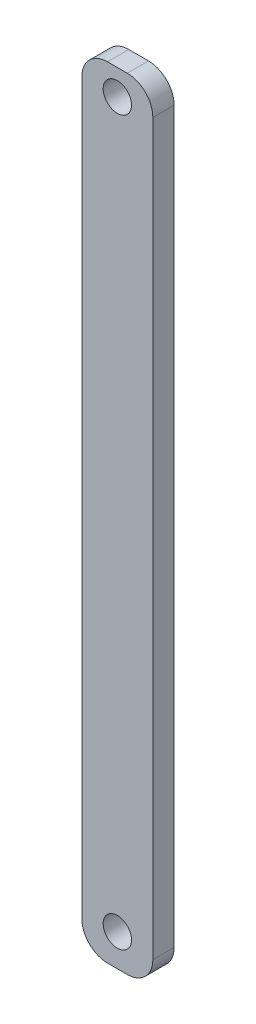
ISO-10303-21;
HEADER;
FILE_DESCRIPTION(('STEP AP214'),'2;1');
FILE_NAME('part.step','',(''),(''),'','','');
FILE_SCHEMA(('AUTOMOTIVE_DESIGN { 1 0 10303 214 1 1 1 1 }'));
ENDSEC;
DATA;
#1=APPLICATION_CONTEXT('core data for automotive mechanical design processes');
#2=APPLICATION_PROTOCOL_DEFINITION('international standard','automotive_design',2000,#1);
#3=PRODUCT_CONTEXT('',#1,'mechanical');
#4=PRODUCT('Part','Part','',(#3));
#5=PRODUCT_RELATED_PRODUCT_CATEGORY('part','',(#4));
#6=PRODUCT_DEFINITION_FORMATION('','',#4);
#7=PRODUCT_DEFINITION_CONTEXT('part definition',#1,'design');
#8=PRODUCT_DEFINITION('design','',#6,#7);
#9=PRODUCT_DEFINITION_SHAPE('','',#8);
#10=(LENGTH_UNIT() NAMED_UNIT(*) SI_UNIT(.MILLI.,.METRE.));
#11=(NAMED_UNIT(*) PLANE_ANGLE_UNIT() SI_UNIT($,.RADIAN.));
#12=(NAMED_UNIT(*) SI_UNIT($,.STERADIAN.) SOLID_ANGLE_UNIT());
#13=UNCERTAINTY_MEASURE_WITH_UNIT(LENGTH_MEASURE(1.E-05),#10,'distance_accuracy_value','');
#14=(GEOMETRIC_REPRESENTATION_CONTEXT(3) GLOBAL_UNCERTAINTY_ASSIGNED_CONTEXT((#13)) GLOBAL_UNIT_ASSIGNED_CONTEXT((#10,
#11,#12)) REPRESENTATION_CONTEXT('',''));
#15=CARTESIAN_POINT('',(0.,0.,0.));
#16=DIRECTION('',(0.,0.,1.));
#17=DIRECTION('',(1.,0.,0.));
#18=AXIS2_PLACEMENT_3D('',#15,#16,#17);
#19=CARTESIAN_POINT('',(-12.7000000000001,-321.4,7.5));
#20=DIRECTION('',(1.,0.,0.));
#21=DIRECTION('',(0.,0.,-1.));
#22=AXIS2_PLACEMENT_3D('',#19,#20,#21);
#23=PLANE('',#22);
#24=DIRECTION('',(0.,-1.,0.));
#25=VECTOR('',#24,1.);
#26=CARTESIAN_POINT('',(-12.7000000000001,-321.4,-7.5));
#27=LINE('',#26,#25);
#28=CARTESIAN_POINT('',(-12.7000000000001,210.6,-7.5));
#29=VERTEX_POINT('',#28);
#30=CARTESIAN_POINT('',(-12.7000000000001,-303.4,-7.5));
#31=VERTEX_POINT('',#30);
#32=EDGE_CURVE('E146',#29,#31,#27,.T.);
#33=ORIENTED_EDGE('',*,*,#32,.T.);
#34=DIRECTION('',(0.,0.,-1.));
#35=VECTOR('',#34,1.);
#36=CARTESIAN_POINT('',(-12.7000000000001,-303.4,7.5));
#37=LINE('',#36,#35);
#38=CARTESIAN_POINT('',(-12.7000000000001,-303.4,7.5));
#39=VERTEX_POINT('',#38);
#40=EDGE_CURVE('E180',#31,#39,#37,.F.);
#41=ORIENTED_EDGE('',*,*,#40,.T.);
#42=DIRECTION('',(0.,-1.,0.));
#43=VECTOR('',#42,1.);
#44=CARTESIAN_POINT('',(-12.7000000000001,-321.4,7.5));
#45=LINE('',#44,#43);
#46=CARTESIAN_POINT('',(-12.7000000000001,210.6,7.5));
#47=VERTEX_POINT('',#46);
#48=EDGE_CURVE('E144',#47,#39,#45,.T.);
#49=ORIENTED_EDGE('',*,*,#48,.F.);
#50=DIRECTION('',(0.,0.,-1.));
#51=VECTOR('',#50,1.);
#52=CARTESIAN_POINT('',(-12.7000000000001,210.6,7.5));
#53=LINE('',#52,#51);
#54=EDGE_CURVE('E176',#47,#29,#53,.T.);
#55=ORIENTED_EDGE('',*,*,#54,.T.);
#56=EDGE_LOOP('',(#33,#41,#49,#55));
#57=FACE_BOUND('',#56,.T.);
#58=ADVANCED_FACE('F45',(#57),#23,.F.);
#59=CARTESIAN_POINT('',(37.2999999999999,-321.4,7.5));
#60=DIRECTION('',(0.,1.,0.));
#61=DIRECTION('',(0.,0.,1.));
#62=AXIS2_PLACEMENT_3D('',#59,#60,#61);
#63=PLANE('',#62);
#64=DIRECTION('',(1.,0.,0.));
#65=VECTOR('',#64,1.);
#66=CARTESIAN_POINT('',(37.2999999999999,-321.4,-7.5));
#67=LINE('',#66,#65);
#68=CARTESIAN_POINT('',(5.29999999999993,-321.4,-7.5));
#69=VERTEX_POINT('',#68);
#70=CARTESIAN_POINT('',(19.2999999999999,-321.4,-7.5));
#71=VERTEX_POINT('',#70);
#72=EDGE_CURVE('E140',#69,#71,#67,.T.);
#73=ORIENTED_EDGE('',*,*,#72,.T.);
#74=DIRECTION('',(0.,0.,-1.));
#75=VECTOR('',#74,1.);
#76=CARTESIAN_POINT('',(19.2999999999999,-321.4,7.5));
#77=LINE('',#76,#75);
#78=CARTESIAN_POINT('',(19.2999999999999,-321.4,7.5));
#79=VERTEX_POINT('',#78);
#80=EDGE_CURVE('E116',#71,#79,#77,.F.);
#81=ORIENTED_EDGE('',*,*,#80,.T.);
#82=DIRECTION('',(1.,0.,0.));
#83=VECTOR('',#82,1.);
#84=CARTESIAN_POINT('',(37.2999999999999,-321.4,7.5));
#85=LINE('',#84,#83);
#86=CARTESIAN_POINT('',(5.29999999999993,-321.4,7.5));
#87=VERTEX_POINT('',#86);
#88=EDGE_CURVE('E199',#87,#79,#85,.T.);
#89=ORIENTED_EDGE('',*,*,#88,.F.);
#90=DIRECTION('',(0.,0.,-1.));
#91=VECTOR('',#90,1.);
#92=CARTESIAN_POINT('',(5.29999999999993,-321.4,7.5));
#93=LINE('',#92,#91);
#94=EDGE_CURVE('E122',#87,#69,#93,.T.);
#95=ORIENTED_EDGE('',*,*,#94,.T.);
#96=EDGE_LOOP('',(#73,#81,#89,#95));
#97=FACE_BOUND('',#96,.T.);
#98=ADVANCED_FACE('F245',(#97),#63,.F.);
#99=CARTESIAN_POINT('',(37.2999999999999,-321.4,7.5));
#100=DIRECTION('',(-1.,0.,0.));
#101=DIRECTION('',(0.,0.,1.));
#102=AXIS2_PLACEMENT_3D('',#99,#100,#101);
#103=PLANE('',#102);
#104=DIRECTION('',(0.,1.,0.));
#105=VECTOR('',#104,1.);
#106=CARTESIAN_POINT('',(37.2999999999999,-321.4,7.5));
#107=LINE('',#106,#105);
#108=CARTESIAN_POINT('',(37.2999999999999,-303.4,7.5));
#109=VERTEX_POINT('',#108);
#110=CARTESIAN_POINT('',(37.2999999999999,210.6,7.5));
#111=VERTEX_POINT('',#110);
#112=EDGE_CURVE('E131',#109,#111,#107,.T.);
#113=ORIENTED_EDGE('',*,*,#112,.F.);
#114=DIRECTION('',(0.,0.,-1.));
#115=VECTOR('',#114,1.);
#116=CARTESIAN_POINT('',(37.2999999999999,-303.4,7.5));
#117=LINE('',#116,#115);
#118=CARTESIAN_POINT('',(37.2999999999999,-303.4,-7.5));
#119=VERTEX_POINT('',#118);
#120=EDGE_CURVE('E115',#109,#119,#117,.T.);
#121=ORIENTED_EDGE('',*,*,#120,.T.);
#122=DIRECTION('',(0.,1.,0.));
#123=VECTOR('',#122,1.);
#124=CARTESIAN_POINT('',(37.2999999999999,-321.4,-7.5));
#125=LINE('',#124,#123);
#126=CARTESIAN_POINT('',(37.2999999999999,210.6,-7.5));
#127=VERTEX_POINT('',#126);
#128=EDGE_CURVE('E129',#119,#127,#125,.T.);
#129=ORIENTED_EDGE('',*,*,#128,.T.);
#130=DIRECTION('',(0.,0.,-1.));
#131=VECTOR('',#130,1.);
#132=CARTESIAN_POINT('',(37.2999999999999,210.6,7.5));
#133=LINE('',#132,#131);
#134=EDGE_CURVE('E134',#127,#111,#133,.F.);
#135=ORIENTED_EDGE('',*,*,#134,.T.);
#136=EDGE_LOOP('',(#113,#121,#129,#135));
#137=FACE_BOUND('',#136,.T.);
#138=ADVANCED_FACE('F128',(#137),#103,.F.);
#139=CARTESIAN_POINT('',(37.2999999999999,228.6,7.5));
#140=DIRECTION('',(0.,-1.,0.));
#141=DIRECTION('',(0.,0.,-1.));
#142=AXIS2_PLACEMENT_3D('',#139,#140,#141);
#143=PLANE('',#142);
#144=DIRECTION('',(-1.,0.,0.));
#145=VECTOR('',#144,1.);
#146=CARTESIAN_POINT('',(37.2999999999999,228.6,-7.5));
#147=LINE('',#146,#145);
#148=CARTESIAN_POINT('',(19.2999999999999,228.6,-7.5));
#149=VERTEX_POINT('',#148);
#150=CARTESIAN_POINT('',(5.29999999999993,228.6,-7.5));
#151=VERTEX_POINT('',#150);
#152=EDGE_CURVE('E139',#149,#151,#147,.T.);
#153=ORIENTED_EDGE('',*,*,#152,.T.);
#154=DIRECTION('',(0.,0.,-1.));
#155=VECTOR('',#154,1.);
#156=CARTESIAN_POINT('',(5.29999999999993,228.6,7.5));
#157=LINE('',#156,#155);
#158=CARTESIAN_POINT('',(5.29999999999993,228.6,7.5));
#159=VERTEX_POINT('',#158);
#160=EDGE_CURVE('E11',#151,#159,#157,.F.);
#161=ORIENTED_EDGE('',*,*,#160,.T.);
#162=DIRECTION('',(-1.,0.,0.));
#163=VECTOR('',#162,1.);
#164=CARTESIAN_POINT('',(37.2999999999999,228.6,7.5));
#165=LINE('',#164,#163);
#166=CARTESIAN_POINT('',(19.2999999999999,228.6,7.5));
#167=VERTEX_POINT('',#166);
#168=EDGE_CURVE('E151',#167,#159,#165,.T.);
#169=ORIENTED_EDGE('',*,*,#168,.F.);
#170=DIRECTION('',(0.,0.,-1.));
#171=VECTOR('',#170,1.);
#172=CARTESIAN_POINT('',(19.2999999999999,228.6,7.5));
#173=LINE('',#172,#171);
#174=EDGE_CURVE('E54',#167,#149,#173,.T.);
#175=ORIENTED_EDGE('',*,*,#174,.T.);
#176=EDGE_LOOP('',(#153,#161,#169,#175));
#177=FACE_BOUND('',#176,.T.);
#178=ADVANCED_FACE('F185',(#177),#143,.F.);
#179=CARTESIAN_POINT('',(0.,0.,7.5));
#180=DIRECTION('',(0.,0.,1.));
#181=DIRECTION('',(1.,0.,0.));
#182=AXIS2_PLACEMENT_3D('',#179,#180,#181);
#183=PLANE('',#182);
#184=CARTESIAN_POINT('',(12.2999999999999,-298.842314327089,7.5));
#185=DIRECTION('',(0.,0.,1.));
#186=DIRECTION('',(1.,0.,0.));
#187=AXIS2_PLACEMENT_3D('',#184,#185,#186);
#188=CIRCLE('',#187,10.);
#189=CARTESIAN_POINT('',(22.2999999999999,-298.842314327089,7.5));
#190=VERTEX_POINT('',#189);
#191=EDGE_CURVE('E221',#190,#190,#188,.T.);
#192=ORIENTED_EDGE('',*,*,#191,.F.);
#193=EDGE_LOOP('',(#192));
#194=FACE_BOUND('',#193,.T.);
#195=CARTESIAN_POINT('',(12.2999999999999,210.6,7.5));
#196=DIRECTION('',(0.,0.,1.));
#197=DIRECTION('',(1.,0.,0.));
#198=AXIS2_PLACEMENT_3D('',#195,#196,#197);
#199=CIRCLE('',#198,10.);
#200=CARTESIAN_POINT('',(22.2999999999999,210.6,7.5));
#201=VERTEX_POINT('',#200);
#202=EDGE_CURVE('E205',#201,#201,#199,.T.);
#203=ORIENTED_EDGE('',*,*,#202,.F.);
#204=EDGE_LOOP('',(#203));
#205=FACE_BOUND('',#204,.T.);
#206=ORIENTED_EDGE('',*,*,#88,.T.);
#207=CARTESIAN_POINT('',(19.2999999999999,-303.4,7.5));
#208=DIRECTION('',(0.,0.,1.));
#209=DIRECTION('',(1.,0.,0.));
#210=AXIS2_PLACEMENT_3D('',#207,#208,#209);
#211=CIRCLE('',#210,18.);
#212=EDGE_CURVE('E173',#79,#109,#211,.T.);
#213=ORIENTED_EDGE('',*,*,#212,.T.);
#214=ORIENTED_EDGE('',*,*,#112,.T.);
#215=CARTESIAN_POINT('',(19.2999999999999,210.6,7.5));
#216=DIRECTION('',(0.,0.,1.));
#217=DIRECTION('',(1.,0.,0.));
#218=AXIS2_PLACEMENT_3D('',#215,#216,#217);
#219=CIRCLE('',#218,18.);
#220=EDGE_CURVE('E66',#111,#167,#219,.T.);
#221=ORIENTED_EDGE('',*,*,#220,.T.);
#222=ORIENTED_EDGE('',*,*,#168,.T.);
#223=CARTESIAN_POINT('',(5.29999999999993,210.6,7.5));
#224=DIRECTION('',(0.,0.,1.));
#225=DIRECTION('',(1.,0.,0.));
#226=AXIS2_PLACEMENT_3D('',#223,#224,#225);
#227=CIRCLE('',#226,18.);
#228=EDGE_CURVE('E167',#159,#47,#227,.T.);
#229=ORIENTED_EDGE('',*,*,#228,.T.);
#230=ORIENTED_EDGE('',*,*,#48,.T.);
#231=CARTESIAN_POINT('',(5.29999999999993,-303.4,7.5));
#232=DIRECTION('',(0.,0.,1.));
#233=DIRECTION('',(1.,0.,0.));
#234=AXIS2_PLACEMENT_3D('',#231,#232,#233);
#235=CIRCLE('',#234,18.);
#236=EDGE_CURVE('E170',#39,#87,#235,.T.);
#237=ORIENTED_EDGE('',*,*,#236,.T.);
#238=EDGE_LOOP('',(#206,#213,#214,#221,#222,#229,#230,#237));
#239=FACE_BOUND('',#238,.T.);
#240=ADVANCED_FACE('F237',(#194,#205,#239),#183,.T.);
#241=CARTESIAN_POINT('',(0.,0.,-7.5));
#242=DIRECTION('',(0.,0.,1.));
#243=DIRECTION('',(1.,0.,0.));
#244=AXIS2_PLACEMENT_3D('',#241,#242,#243);
#245=PLANE('',#244);
#246=CARTESIAN_POINT('',(12.2999999999999,-298.842314327089,-7.5));
#247=DIRECTION('',(0.,0.,1.));
#248=DIRECTION('',(1.,0.,0.));
#249=AXIS2_PLACEMENT_3D('',#246,#247,#248);
#250=CIRCLE('',#249,10.);
#251=CARTESIAN_POINT('',(22.2999999999999,-298.842314327089,-7.5));
#252=VERTEX_POINT('',#251);
#253=EDGE_CURVE('E219',#252,#252,#250,.T.);
#254=ORIENTED_EDGE('',*,*,#253,.T.);
#255=EDGE_LOOP('',(#254));
#256=FACE_BOUND('',#255,.T.);
#257=CARTESIAN_POINT('',(12.2999999999999,210.6,-7.5));
#258=DIRECTION('',(0.,0.,1.));
#259=DIRECTION('',(1.,0.,0.));
#260=AXIS2_PLACEMENT_3D('',#257,#258,#259);
#261=CIRCLE('',#260,10.);
#262=CARTESIAN_POINT('',(22.2999999999999,210.6,-7.5));
#263=VERTEX_POINT('',#262);
#264=EDGE_CURVE('E212',#263,#263,#261,.T.);
#265=ORIENTED_EDGE('',*,*,#264,.T.);
#266=EDGE_LOOP('',(#265));
#267=FACE_BOUND('',#266,.T.);
#268=ORIENTED_EDGE('',*,*,#128,.F.);
#269=CARTESIAN_POINT('',(19.2999999999999,-303.4,-7.5));
#270=DIRECTION('',(0.,0.,1.));
#271=DIRECTION('',(1.,0.,0.));
#272=AXIS2_PLACEMENT_3D('',#269,#270,#271);
#273=CIRCLE('',#272,18.);
#274=EDGE_CURVE('E111',#119,#71,#273,.F.);
#275=ORIENTED_EDGE('',*,*,#274,.T.);
#276=ORIENTED_EDGE('',*,*,#72,.F.);
#277=CARTESIAN_POINT('',(5.29999999999993,-303.4,-7.5));
#278=DIRECTION('',(0.,0.,1.));
#279=DIRECTION('',(1.,0.,0.));
#280=AXIS2_PLACEMENT_3D('',#277,#278,#279);
#281=CIRCLE('',#280,18.);
#282=EDGE_CURVE('E123',#69,#31,#281,.F.);
#283=ORIENTED_EDGE('',*,*,#282,.T.);
#284=ORIENTED_EDGE('',*,*,#32,.F.);
#285=CARTESIAN_POINT('',(5.29999999999993,210.6,-7.5));
#286=DIRECTION('',(0.,0.,1.));
#287=DIRECTION('',(1.,0.,0.));
#288=AXIS2_PLACEMENT_3D('',#285,#286,#287);
#289=CIRCLE('',#288,18.);
#290=EDGE_CURVE('E155',#29,#151,#289,.F.);
#291=ORIENTED_EDGE('',*,*,#290,.T.);
#292=ORIENTED_EDGE('',*,*,#152,.F.);
#293=CARTESIAN_POINT('',(19.2999999999999,210.6,-7.5));
#294=DIRECTION('',(0.,0.,1.));
#295=DIRECTION('',(1.,0.,0.));
#296=AXIS2_PLACEMENT_3D('',#293,#294,#295);
#297=CIRCLE('',#296,18.);
#298=EDGE_CURVE('E133',#149,#127,#297,.F.);
#299=ORIENTED_EDGE('',*,*,#298,.T.);
#300=EDGE_LOOP('',(#268,#275,#276,#283,#284,#291,#292,#299));
#301=FACE_BOUND('',#300,.T.);
#302=ADVANCED_FACE('F136',(#256,#267,#301),#245,.F.);
#303=CARTESIAN_POINT('',(19.2999999999999,-303.4,7.5));
#304=DIRECTION('',(0.,0.,-1.));
#305=DIRECTION('',(-1.,0.,0.));
#306=AXIS2_PLACEMENT_3D('',#303,#304,#305);
#307=CYLINDRICAL_SURFACE('',#306,18.);
#308=ORIENTED_EDGE('',*,*,#212,.F.);
#309=ORIENTED_EDGE('',*,*,#80,.F.);
#310=ORIENTED_EDGE('',*,*,#274,.F.);
#311=ORIENTED_EDGE('',*,*,#120,.F.);
#312=EDGE_LOOP('',(#308,#309,#310,#311));
#313=FACE_BOUND('',#312,.T.);
#314=ADVANCED_FACE('F114',(#313),#307,.T.);
#315=CARTESIAN_POINT('',(5.29999999999993,-303.4,7.5));
#316=DIRECTION('',(0.,0.,-1.));
#317=DIRECTION('',(-1.,0.,0.));
#318=AXIS2_PLACEMENT_3D('',#315,#316,#317);
#319=CYLINDRICAL_SURFACE('',#318,18.);
#320=ORIENTED_EDGE('',*,*,#236,.F.);
#321=ORIENTED_EDGE('',*,*,#40,.F.);
#322=ORIENTED_EDGE('',*,*,#282,.F.);
#323=ORIENTED_EDGE('',*,*,#94,.F.);
#324=EDGE_LOOP('',(#320,#321,#322,#323));
#325=FACE_BOUND('',#324,.T.);
#326=ADVANCED_FACE('F247',(#325),#319,.T.);
#327=CARTESIAN_POINT('',(5.29999999999993,210.6,7.5));
#328=DIRECTION('',(0.,0.,-1.));
#329=DIRECTION('',(-1.,0.,0.));
#330=AXIS2_PLACEMENT_3D('',#327,#328,#329);
#331=CYLINDRICAL_SURFACE('',#330,18.);
#332=ORIENTED_EDGE('',*,*,#228,.F.);
#333=ORIENTED_EDGE('',*,*,#160,.F.);
#334=ORIENTED_EDGE('',*,*,#290,.F.);
#335=ORIENTED_EDGE('',*,*,#54,.F.);
#336=EDGE_LOOP('',(#332,#333,#334,#335));
#337=FACE_BOUND('',#336,.T.);
#338=ADVANCED_FACE('F192',(#337),#331,.T.);
#339=CARTESIAN_POINT('',(19.2999999999999,210.6,7.5));
#340=DIRECTION('',(0.,0.,-1.));
#341=DIRECTION('',(-1.,0.,0.));
#342=AXIS2_PLACEMENT_3D('',#339,#340,#341);
#343=CYLINDRICAL_SURFACE('',#342,18.);
#344=ORIENTED_EDGE('',*,*,#220,.F.);
#345=ORIENTED_EDGE('',*,*,#134,.F.);
#346=ORIENTED_EDGE('',*,*,#298,.F.);
#347=ORIENTED_EDGE('',*,*,#174,.F.);
#348=EDGE_LOOP('',(#344,#345,#346,#347));
#349=FACE_BOUND('',#348,.T.);
#350=ADVANCED_FACE('F47',(#349),#343,.T.);
#351=CARTESIAN_POINT('',(12.2999999999999,210.6,-7.5));
#352=DIRECTION('',(0.,0.,1.));
#353=DIRECTION('',(1.,0.,0.));
#354=AXIS2_PLACEMENT_3D('',#351,#352,#353);
#355=CYLINDRICAL_SURFACE('',#354,10.);
#356=ORIENTED_EDGE('',*,*,#264,.F.);
#357=EDGE_LOOP('',(#356));
#358=FACE_BOUND('',#357,.T.);
#359=ORIENTED_EDGE('',*,*,#202,.T.);
#360=EDGE_LOOP('',(#359));
#361=FACE_BOUND('',#360,.T.);
#362=ADVANCED_FACE('F233',(#358,#361),#355,.F.);
#363=CARTESIAN_POINT('',(12.2999999999999,-298.842314327089,-7.5));
#364=DIRECTION('',(0.,0.,1.));
#365=DIRECTION('',(1.,0.,0.));
#366=AXIS2_PLACEMENT_3D('',#363,#364,#365);
#367=CYLINDRICAL_SURFACE('',#366,10.);
#368=ORIENTED_EDGE('',*,*,#253,.F.);
#369=EDGE_LOOP('',(#368));
#370=FACE_BOUND('',#369,.T.);
#371=ORIENTED_EDGE('',*,*,#191,.T.);
#372=EDGE_LOOP('',(#371));
#373=FACE_BOUND('',#372,.T.);
#374=ADVANCED_FACE('F230',(#370,#373),#367,.F.);
#375=CLOSED_SHELL('',(#58,#98,#138,#178,#240,#302,#314,#326,#338,#350,#362,#374));
#376=MANIFOLD_SOLID_BREP('B2',#375);
#377=ADVANCED_BREP_SHAPE_REPRESENTATION('',(#18,#376),#14);
#378=SHAPE_DEFINITION_REPRESENTATION(#9,#377);
ENDSEC;
END-ISO-10303-21;
